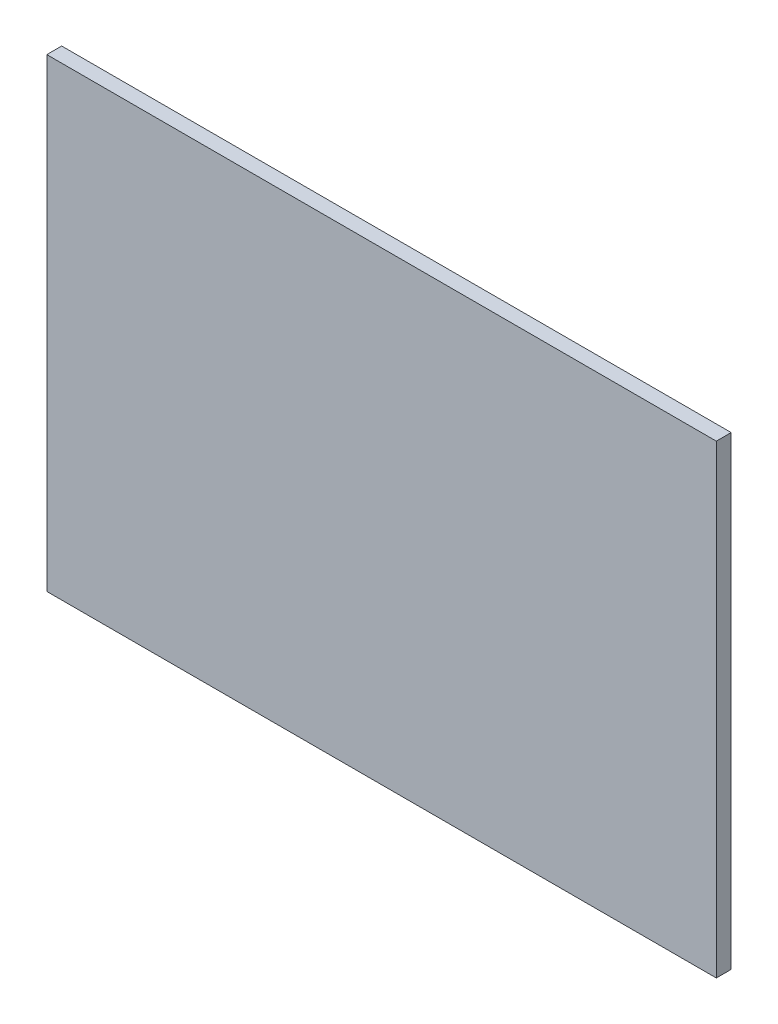
ISO-10303-21;
HEADER;
FILE_DESCRIPTION(('STEP AP214'),'2;1');
FILE_NAME('part.step','',(''),(''),'','','');
FILE_SCHEMA(('AUTOMOTIVE_DESIGN { 1 0 10303 214 1 1 1 1 }'));
ENDSEC;
DATA;
#1=APPLICATION_CONTEXT('core data for automotive mechanical design processes');
#2=APPLICATION_PROTOCOL_DEFINITION('international standard','automotive_design',2000,#1);
#3=PRODUCT_CONTEXT('',#1,'mechanical');
#4=PRODUCT('Part','Part','',(#3));
#5=PRODUCT_RELATED_PRODUCT_CATEGORY('part','',(#4));
#6=PRODUCT_DEFINITION_FORMATION('','',#4);
#7=PRODUCT_DEFINITION_CONTEXT('part definition',#1,'design');
#8=PRODUCT_DEFINITION('design','',#6,#7);
#9=PRODUCT_DEFINITION_SHAPE('','',#8);
#10=(LENGTH_UNIT() NAMED_UNIT(*) SI_UNIT(.MILLI.,.METRE.));
#11=(NAMED_UNIT(*) PLANE_ANGLE_UNIT() SI_UNIT($,.RADIAN.));
#12=(NAMED_UNIT(*) SI_UNIT($,.STERADIAN.) SOLID_ANGLE_UNIT());
#13=UNCERTAINTY_MEASURE_WITH_UNIT(LENGTH_MEASURE(1.E-05),#10,'distance_accuracy_value','');
#14=(GEOMETRIC_REPRESENTATION_CONTEXT(3) GLOBAL_UNCERTAINTY_ASSIGNED_CONTEXT((#13)) GLOBAL_UNIT_ASSIGNED_CONTEXT((#10,
#11,#12)) REPRESENTATION_CONTEXT('',''));
#15=CARTESIAN_POINT('',(0.,0.,0.));
#16=DIRECTION('',(0.,0.,1.));
#17=DIRECTION('',(1.,0.,0.));
#18=AXIS2_PLACEMENT_3D('',#15,#16,#17);
#19=CARTESIAN_POINT('',(-90.,-62.5,-2.));
#20=DIRECTION('',(-1.,0.,0.));
#21=DIRECTION('',(0.,0.,1.));
#22=AXIS2_PLACEMENT_3D('',#19,#20,#21);
#23=PLANE('',#22);
#24=DIRECTION('',(0.,0.,1.));
#25=VECTOR('',#24,1.);
#26=CARTESIAN_POINT('',(-90.,-62.5,-2.));
#27=LINE('',#26,#25);
#28=CARTESIAN_POINT('',(-90.,-62.5,-2.));
#29=VERTEX_POINT('',#28);
#30=CARTESIAN_POINT('',(-90.,-62.5,2.));
#31=VERTEX_POINT('',#30);
#32=EDGE_CURVE('E48',#29,#31,#27,.T.);
#33=ORIENTED_EDGE('',*,*,#32,.T.);
#34=DIRECTION('',(0.,-1.,0.));
#35=VECTOR('',#34,1.);
#36=CARTESIAN_POINT('',(-90.,-62.5,2.));
#37=LINE('',#36,#35);
#38=CARTESIAN_POINT('',(-90.,62.5,2.));
#39=VERTEX_POINT('',#38);
#40=EDGE_CURVE('E86',#39,#31,#37,.T.);
#41=ORIENTED_EDGE('',*,*,#40,.F.);
#42=DIRECTION('',(0.,0.,1.));
#43=VECTOR('',#42,1.);
#44=CARTESIAN_POINT('',(-90.,62.5,-2.));
#45=LINE('',#44,#43);
#46=CARTESIAN_POINT('',(-90.,62.5,-2.));
#47=VERTEX_POINT('',#46);
#48=EDGE_CURVE('E11',#47,#39,#45,.T.);
#49=ORIENTED_EDGE('',*,*,#48,.F.);
#50=DIRECTION('',(0.,-1.,0.));
#51=VECTOR('',#50,1.);
#52=CARTESIAN_POINT('',(-90.,-62.5,-2.));
#53=LINE('',#52,#51);
#54=EDGE_CURVE('E87',#47,#29,#53,.T.);
#55=ORIENTED_EDGE('',*,*,#54,.T.);
#56=EDGE_LOOP('',(#33,#41,#49,#55));
#57=FACE_BOUND('',#56,.T.);
#58=ADVANCED_FACE('F45',(#57),#23,.T.);
#59=CARTESIAN_POINT('',(90.,62.5,-2.));
#60=DIRECTION('',(0.,1.,0.));
#61=DIRECTION('',(-1.,0.,0.));
#62=AXIS2_PLACEMENT_3D('',#59,#60,#61);
#63=PLANE('',#62);
#64=ORIENTED_EDGE('',*,*,#48,.T.);
#65=DIRECTION('',(-1.,0.,0.));
#66=VECTOR('',#65,1.);
#67=CARTESIAN_POINT('',(90.,62.5,2.));
#68=LINE('',#67,#66);
#69=CARTESIAN_POINT('',(90.,62.5,2.));
#70=VERTEX_POINT('',#69);
#71=EDGE_CURVE('E105',#70,#39,#68,.T.);
#72=ORIENTED_EDGE('',*,*,#71,.F.);
#73=DIRECTION('',(0.,0.,1.));
#74=VECTOR('',#73,1.);
#75=CARTESIAN_POINT('',(90.,62.5,-2.));
#76=LINE('',#75,#74);
#77=CARTESIAN_POINT('',(90.,62.5,-2.));
#78=VERTEX_POINT('',#77);
#79=EDGE_CURVE('E54',#78,#70,#76,.T.);
#80=ORIENTED_EDGE('',*,*,#79,.F.);
#81=DIRECTION('',(-1.,0.,0.));
#82=VECTOR('',#81,1.);
#83=CARTESIAN_POINT('',(90.,62.5,-2.));
#84=LINE('',#83,#82);
#85=EDGE_CURVE('E93',#78,#47,#84,.T.);
#86=ORIENTED_EDGE('',*,*,#85,.T.);
#87=EDGE_LOOP('',(#64,#72,#80,#86));
#88=FACE_BOUND('',#87,.T.);
#89=ADVANCED_FACE('F129',(#88),#63,.T.);
#90=CARTESIAN_POINT('',(90.,-62.5,-2.));
#91=DIRECTION('',(1.,0.,0.));
#92=DIRECTION('',(0.,0.,-1.));
#93=AXIS2_PLACEMENT_3D('',#90,#91,#92);
#94=PLANE('',#93);
#95=ORIENTED_EDGE('',*,*,#79,.T.);
#96=DIRECTION('',(0.,1.,0.));
#97=VECTOR('',#96,1.);
#98=CARTESIAN_POINT('',(90.,-62.5,2.));
#99=LINE('',#98,#97);
#100=CARTESIAN_POINT('',(90.,-62.5,2.));
#101=VERTEX_POINT('',#100);
#102=EDGE_CURVE('E101',#101,#70,#99,.T.);
#103=ORIENTED_EDGE('',*,*,#102,.F.);
#104=DIRECTION('',(0.,0.,1.));
#105=VECTOR('',#104,1.);
#106=CARTESIAN_POINT('',(90.,-62.5,-2.));
#107=LINE('',#106,#105);
#108=CARTESIAN_POINT('',(90.,-62.5,-2.));
#109=VERTEX_POINT('',#108);
#110=EDGE_CURVE('E92',#109,#101,#107,.T.);
#111=ORIENTED_EDGE('',*,*,#110,.F.);
#112=DIRECTION('',(0.,1.,0.));
#113=VECTOR('',#112,1.);
#114=CARTESIAN_POINT('',(90.,-62.5,-2.));
#115=LINE('',#114,#113);
#116=EDGE_CURVE('E118',#109,#78,#115,.T.);
#117=ORIENTED_EDGE('',*,*,#116,.T.);
#118=EDGE_LOOP('',(#95,#103,#111,#117));
#119=FACE_BOUND('',#118,.T.);
#120=ADVANCED_FACE('F126',(#119),#94,.T.);
#121=CARTESIAN_POINT('',(90.,-62.5,-2.));
#122=DIRECTION('',(0.,-1.,0.));
#123=DIRECTION('',(1.,0.,0.));
#124=AXIS2_PLACEMENT_3D('',#121,#122,#123);
#125=PLANE('',#124);
#126=ORIENTED_EDGE('',*,*,#110,.T.);
#127=DIRECTION('',(1.,0.,0.));
#128=VECTOR('',#127,1.);
#129=CARTESIAN_POINT('',(90.,-62.5,2.));
#130=LINE('',#129,#128);
#131=EDGE_CURVE('E95',#31,#101,#130,.T.);
#132=ORIENTED_EDGE('',*,*,#131,.F.);
#133=ORIENTED_EDGE('',*,*,#32,.F.);
#134=DIRECTION('',(1.,0.,0.));
#135=VECTOR('',#134,1.);
#136=CARTESIAN_POINT('',(90.,-62.5,-2.));
#137=LINE('',#136,#135);
#138=EDGE_CURVE('E115',#29,#109,#137,.T.);
#139=ORIENTED_EDGE('',*,*,#138,.T.);
#140=EDGE_LOOP('',(#126,#132,#133,#139));
#141=FACE_BOUND('',#140,.T.);
#142=ADVANCED_FACE('F96',(#141),#125,.T.);
#143=CARTESIAN_POINT('',(0.,0.,-2.));
#144=DIRECTION('',(0.,0.,1.));
#145=DIRECTION('',(1.,0.,0.));
#146=AXIS2_PLACEMENT_3D('',#143,#144,#145);
#147=PLANE('',#146);
#148=ORIENTED_EDGE('',*,*,#54,.F.);
#149=ORIENTED_EDGE('',*,*,#85,.F.);
#150=ORIENTED_EDGE('',*,*,#116,.F.);
#151=ORIENTED_EDGE('',*,*,#138,.F.);
#152=EDGE_LOOP('',(#148,#149,#150,#151));
#153=FACE_BOUND('',#152,.T.);
#154=ADVANCED_FACE('F131',(#153),#147,.F.);
#155=CARTESIAN_POINT('',(0.,0.,2.));
#156=DIRECTION('',(0.,0.,1.));
#157=DIRECTION('',(1.,0.,0.));
#158=AXIS2_PLACEMENT_3D('',#155,#156,#157);
#159=PLANE('',#158);
#160=ORIENTED_EDGE('',*,*,#40,.T.);
#161=ORIENTED_EDGE('',*,*,#131,.T.);
#162=ORIENTED_EDGE('',*,*,#102,.T.);
#163=ORIENTED_EDGE('',*,*,#71,.T.);
#164=EDGE_LOOP('',(#160,#161,#162,#163));
#165=FACE_BOUND('',#164,.T.);
#166=ADVANCED_FACE('F104',(#165),#159,.T.);
#167=CLOSED_SHELL('',(#58,#89,#120,#142,#154,#166));
#168=MANIFOLD_SOLID_BREP('B2',#167);
#169=ADVANCED_BREP_SHAPE_REPRESENTATION('',(#18,#168),#14);
#170=SHAPE_DEFINITION_REPRESENTATION(#9,#169);
ENDSEC;
END-ISO-10303-21;
